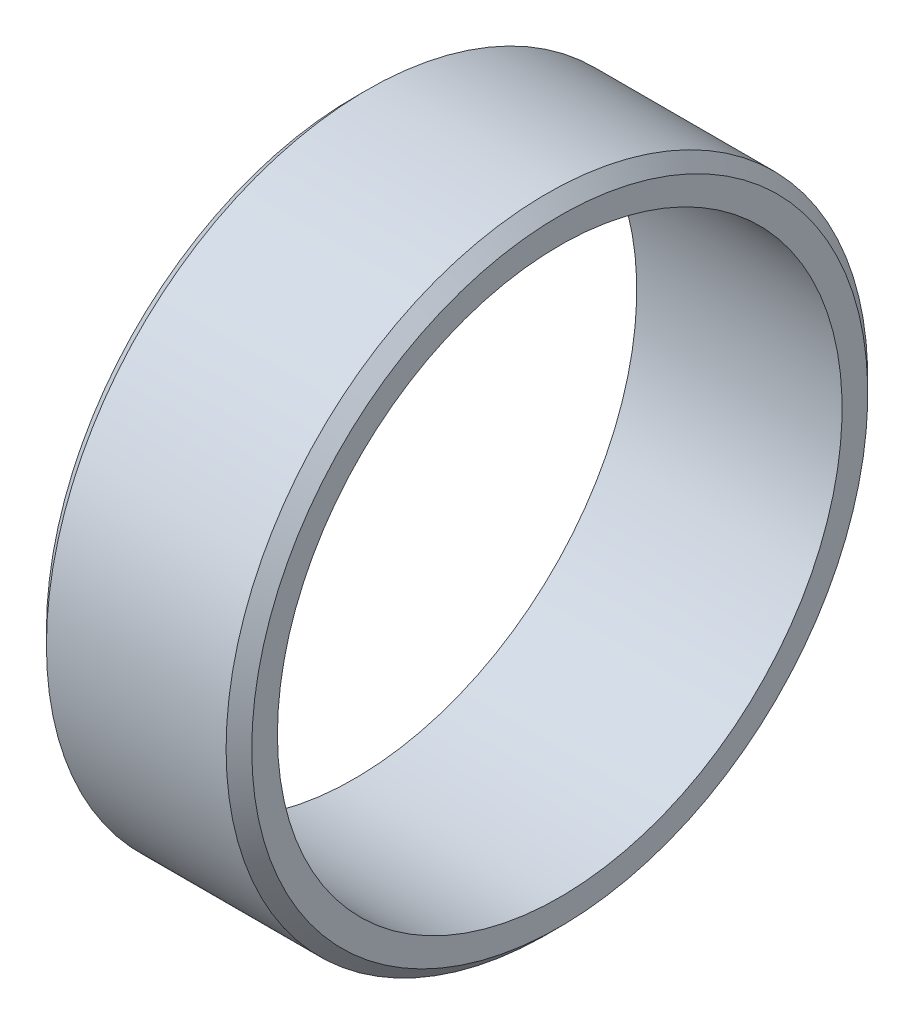
ISO-10303-21;
HEADER;
FILE_DESCRIPTION(('STEP AP214'),'2;1');
FILE_NAME('part.step','',(''),(''),'','','');
FILE_SCHEMA(('AUTOMOTIVE_DESIGN { 1 0 10303 214 1 1 1 1 }'));
ENDSEC;
DATA;
#1=APPLICATION_CONTEXT('core data for automotive mechanical design processes');
#2=APPLICATION_PROTOCOL_DEFINITION('international standard','automotive_design',2000,#1);
#3=PRODUCT_CONTEXT('',#1,'mechanical');
#4=PRODUCT('Part','Part','',(#3));
#5=PRODUCT_RELATED_PRODUCT_CATEGORY('part','',(#4));
#6=PRODUCT_DEFINITION_FORMATION('','',#4);
#7=PRODUCT_DEFINITION_CONTEXT('part definition',#1,'design');
#8=PRODUCT_DEFINITION('design','',#6,#7);
#9=PRODUCT_DEFINITION_SHAPE('','',#8);
#10=(LENGTH_UNIT() NAMED_UNIT(*) SI_UNIT(.MILLI.,.METRE.));
#11=(NAMED_UNIT(*) PLANE_ANGLE_UNIT() SI_UNIT($,.RADIAN.));
#12=(NAMED_UNIT(*) SI_UNIT($,.STERADIAN.) SOLID_ANGLE_UNIT());
#13=UNCERTAINTY_MEASURE_WITH_UNIT(LENGTH_MEASURE(1.E-05),#10,'distance_accuracy_value','');
#14=(GEOMETRIC_REPRESENTATION_CONTEXT(3) GLOBAL_UNCERTAINTY_ASSIGNED_CONTEXT((#13)) GLOBAL_UNIT_ASSIGNED_CONTEXT((#10,
#11,#12)) REPRESENTATION_CONTEXT('',''));
#15=CARTESIAN_POINT('',(0.,0.,0.));
#16=DIRECTION('',(0.,0.,1.));
#17=DIRECTION('',(1.,0.,0.));
#18=AXIS2_PLACEMENT_3D('',#15,#16,#17);
#19=CARTESIAN_POINT('',(0.,24.,0.));
#20=DIRECTION('',(1.,0.,0.));
#21=DIRECTION('',(0.,0.,-1.));
#22=AXIS2_PLACEMENT_3D('',#19,#20,#21);
#23=PLANE('',#22);
#24=CARTESIAN_POINT('',(0.,0.,0.));
#25=DIRECTION('',(-1.,0.,0.));
#26=DIRECTION('',(0.,0.,1.));
#27=AXIS2_PLACEMENT_3D('',#24,#25,#26);
#28=CIRCLE('',#27,22.);
#29=CARTESIAN_POINT('',(0.,0.,22.));
#30=VERTEX_POINT('',#29);
#31=EDGE_CURVE('E10',#30,#30,#28,.T.);
#32=ORIENTED_EDGE('',*,*,#31,.F.);
#33=EDGE_LOOP('',(#32));
#34=FACE_BOUND('',#33,.T.);
#35=CARTESIAN_POINT('',(0.,0.,0.));
#36=DIRECTION('',(-1.,0.,0.));
#37=DIRECTION('',(0.,0.,1.));
#38=AXIS2_PLACEMENT_3D('',#35,#36,#37);
#39=CIRCLE('',#38,24.);
#40=CARTESIAN_POINT('',(0.,0.,24.));
#41=VERTEX_POINT('',#40);
#42=EDGE_CURVE('E52',#41,#41,#39,.T.);
#43=ORIENTED_EDGE('',*,*,#42,.T.);
#44=EDGE_LOOP('',(#43));
#45=FACE_BOUND('',#44,.T.);
#46=ADVANCED_FACE('F30',(#34,#45),#23,.F.);
#47=CARTESIAN_POINT('',(0.,0.,0.));
#48=DIRECTION('',(-1.,0.,0.));
#49=DIRECTION('',(0.,0.,1.));
#50=AXIS2_PLACEMENT_3D('',#47,#48,#49);
#51=CYLINDRICAL_SURFACE('',#50,22.);
#52=CARTESIAN_POINT('',(16.,0.,0.));
#53=DIRECTION('',(-1.,0.,0.));
#54=DIRECTION('',(0.,0.,1.));
#55=AXIS2_PLACEMENT_3D('',#52,#53,#54);
#56=CIRCLE('',#55,22.);
#57=CARTESIAN_POINT('',(16.,0.,22.));
#58=VERTEX_POINT('',#57);
#59=EDGE_CURVE('E36',#58,#58,#56,.T.);
#60=ORIENTED_EDGE('',*,*,#59,.F.);
#61=EDGE_LOOP('',(#60));
#62=FACE_BOUND('',#61,.T.);
#63=ORIENTED_EDGE('',*,*,#31,.T.);
#64=EDGE_LOOP('',(#63));
#65=FACE_BOUND('',#64,.T.);
#66=ADVANCED_FACE('F77',(#62,#65),#51,.F.);
#67=CARTESIAN_POINT('',(16.,22.,0.));
#68=DIRECTION('',(-1.,0.,0.));
#69=DIRECTION('',(0.,0.,1.));
#70=AXIS2_PLACEMENT_3D('',#67,#68,#69);
#71=PLANE('',#70);
#72=CARTESIAN_POINT('',(16.,0.,0.));
#73=DIRECTION('',(-1.,0.,0.));
#74=DIRECTION('',(0.,0.,1.));
#75=AXIS2_PLACEMENT_3D('',#72,#73,#74);
#76=CIRCLE('',#75,24.);
#77=CARTESIAN_POINT('',(16.,0.,24.));
#78=VERTEX_POINT('',#77);
#79=EDGE_CURVE('E40',#78,#78,#76,.T.);
#80=ORIENTED_EDGE('',*,*,#79,.F.);
#81=EDGE_LOOP('',(#80));
#82=FACE_BOUND('',#81,.T.);
#83=ORIENTED_EDGE('',*,*,#59,.T.);
#84=EDGE_LOOP('',(#83));
#85=FACE_BOUND('',#84,.T.);
#86=ADVANCED_FACE('F72',(#82,#85),#71,.F.);
#87=CARTESIAN_POINT('',(16.,0.,0.));
#88=DIRECTION('',(-1.,0.,0.));
#89=DIRECTION('',(0.,0.,1.));
#90=AXIS2_PLACEMENT_3D('',#87,#88,#89);
#91=CONICAL_SURFACE('',#90,24.,0.78539816339745);
#92=CARTESIAN_POINT('',(15.,0.,0.));
#93=DIRECTION('',(-1.,0.,0.));
#94=DIRECTION('',(0.,0.,1.));
#95=AXIS2_PLACEMENT_3D('',#92,#93,#94);
#96=CIRCLE('',#95,25.);
#97=CARTESIAN_POINT('',(15.,0.,25.));
#98=VERTEX_POINT('',#97);
#99=EDGE_CURVE('E44',#98,#98,#96,.T.);
#100=ORIENTED_EDGE('',*,*,#99,.F.);
#101=EDGE_LOOP('',(#100));
#102=FACE_BOUND('',#101,.T.);
#103=ORIENTED_EDGE('',*,*,#79,.T.);
#104=EDGE_LOOP('',(#103));
#105=FACE_BOUND('',#104,.T.);
#106=ADVANCED_FACE('F66',(#102,#105),#91,.T.);
#107=CARTESIAN_POINT('',(0.,0.,0.));
#108=DIRECTION('',(-1.,0.,0.));
#109=DIRECTION('',(0.,0.,1.));
#110=AXIS2_PLACEMENT_3D('',#107,#108,#109);
#111=CYLINDRICAL_SURFACE('',#110,25.);
#112=CARTESIAN_POINT('',(1.,0.,0.));
#113=DIRECTION('',(-1.,0.,0.));
#114=DIRECTION('',(0.,0.,1.));
#115=AXIS2_PLACEMENT_3D('',#112,#113,#114);
#116=CIRCLE('',#115,25.);
#117=CARTESIAN_POINT('',(1.,0.,25.));
#118=VERTEX_POINT('',#117);
#119=EDGE_CURVE('E49',#118,#118,#116,.T.);
#120=ORIENTED_EDGE('',*,*,#119,.F.);
#121=EDGE_LOOP('',(#120));
#122=FACE_BOUND('',#121,.T.);
#123=ORIENTED_EDGE('',*,*,#99,.T.);
#124=EDGE_LOOP('',(#123));
#125=FACE_BOUND('',#124,.T.);
#126=ADVANCED_FACE('F60',(#122,#125),#111,.T.);
#127=CARTESIAN_POINT('',(1.,0.,0.));
#128=DIRECTION('',(1.,0.,0.));
#129=DIRECTION('',(0.,0.,-1.));
#130=AXIS2_PLACEMENT_3D('',#127,#128,#129);
#131=CONICAL_SURFACE('',#130,25.,0.78539816339745);
#132=ORIENTED_EDGE('',*,*,#42,.F.);
#133=EDGE_LOOP('',(#132));
#134=FACE_BOUND('',#133,.T.);
#135=ORIENTED_EDGE('',*,*,#119,.T.);
#136=EDGE_LOOP('',(#135));
#137=FACE_BOUND('',#136,.T.);
#138=ADVANCED_FACE('F57',(#134,#137),#131,.T.);
#139=CLOSED_SHELL('',(#46,#66,#86,#106,#126,#138));
#140=MANIFOLD_SOLID_BREP('B2',#139);
#141=ADVANCED_BREP_SHAPE_REPRESENTATION('',(#18,#140),#14);
#142=SHAPE_DEFINITION_REPRESENTATION(#9,#141);
ENDSEC;
END-ISO-10303-21;
